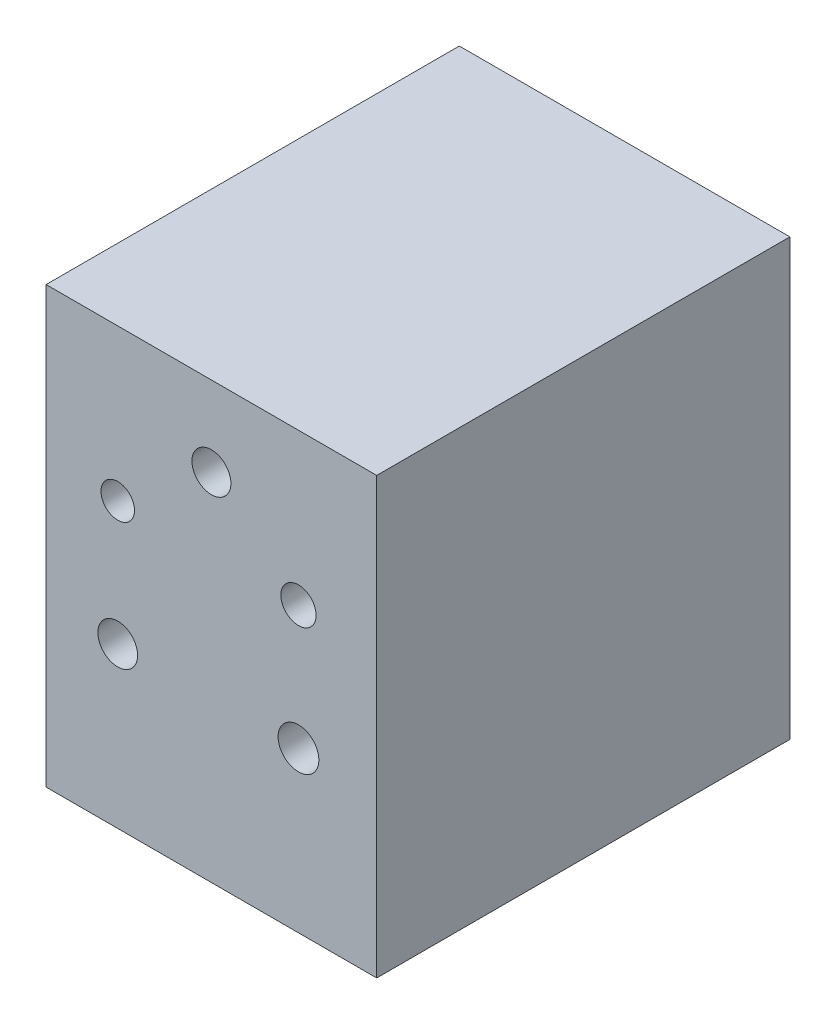
ISO-10303-21;
HEADER;
FILE_DESCRIPTION(('STEP AP214'),'2;1');
FILE_NAME('part.step','',(''),(''),'','','');
FILE_SCHEMA(('AUTOMOTIVE_DESIGN { 1 0 10303 214 1 1 1 1 }'));
ENDSEC;
DATA;
#1=APPLICATION_CONTEXT('core data for automotive mechanical design processes');
#2=APPLICATION_PROTOCOL_DEFINITION('international standard','automotive_design',2000,#1);
#3=PRODUCT_CONTEXT('',#1,'mechanical');
#4=PRODUCT('Part','Part','',(#3));
#5=PRODUCT_RELATED_PRODUCT_CATEGORY('part','',(#4));
#6=PRODUCT_DEFINITION_FORMATION('','',#4);
#7=PRODUCT_DEFINITION_CONTEXT('part definition',#1,'design');
#8=PRODUCT_DEFINITION('design','',#6,#7);
#9=PRODUCT_DEFINITION_SHAPE('','',#8);
#10=(LENGTH_UNIT() NAMED_UNIT(*) SI_UNIT(.MILLI.,.METRE.));
#11=(NAMED_UNIT(*) PLANE_ANGLE_UNIT() SI_UNIT($,.RADIAN.));
#12=(NAMED_UNIT(*) SI_UNIT($,.STERADIAN.) SOLID_ANGLE_UNIT());
#13=UNCERTAINTY_MEASURE_WITH_UNIT(LENGTH_MEASURE(1.E-05),#10,'distance_accuracy_value','');
#14=(GEOMETRIC_REPRESENTATION_CONTEXT(3) GLOBAL_UNCERTAINTY_ASSIGNED_CONTEXT((#13)) GLOBAL_UNIT_ASSIGNED_CONTEXT((#10,
#11,#12)) REPRESENTATION_CONTEXT('',''));
#15=CARTESIAN_POINT('',(0.,0.,0.));
#16=DIRECTION('',(0.,0.,1.));
#17=DIRECTION('',(1.,0.,0.));
#18=AXIS2_PLACEMENT_3D('',#15,#16,#17);
#19=CARTESIAN_POINT('',(0.,0.,115.));
#20=DIRECTION('',(0.,0.,-1.));
#21=DIRECTION('',(-1.,0.,0.));
#22=AXIS2_PLACEMENT_3D('',#19,#20,#21);
#23=PLANE('',#22);
#24=DIRECTION('',(0.,1.,0.));
#25=VECTOR('',#24,1.);
#26=CARTESIAN_POINT('',(120.000640556542,-24.9202664576803,115.));
#27=LINE('',#26,#25);
#28=CARTESIAN_POINT('',(120.000640556542,-24.9202664576803,115.));
#29=VERTEX_POINT('',#28);
#30=CARTESIAN_POINT('',(120.000640556542,96.2305673981191,115.));
#31=VERTEX_POINT('',#30);
#32=EDGE_CURVE('E91',#29,#31,#27,.T.);
#33=ORIENTED_EDGE('',*,*,#32,.T.);
#34=DIRECTION('',(-1.,0.,0.));
#35=VECTOR('',#34,1.);
#36=CARTESIAN_POINT('',(27.987403330605,96.2305673981191,115.));
#37=LINE('',#36,#35);
#38=CARTESIAN_POINT('',(27.987403330605,96.2305673981191,115.));
#39=VERTEX_POINT('',#38);
#40=EDGE_CURVE('E86',#31,#39,#37,.T.);
#41=ORIENTED_EDGE('',*,*,#40,.T.);
#42=DIRECTION('',(0.,-1.,0.));
#43=VECTOR('',#42,1.);
#44=CARTESIAN_POINT('',(27.987403330605,-24.9202664576803,115.));
#45=LINE('',#44,#43);
#46=CARTESIAN_POINT('',(27.987403330605,-24.9202664576803,115.));
#47=VERTEX_POINT('',#46);
#48=EDGE_CURVE('E89',#39,#47,#45,.T.);
#49=ORIENTED_EDGE('',*,*,#48,.T.);
#50=DIRECTION('',(1.,0.,0.));
#51=VECTOR('',#50,1.);
#52=CARTESIAN_POINT('',(27.987403330605,-24.9202664576803,115.));
#53=LINE('',#52,#51);
#54=EDGE_CURVE('E56',#47,#29,#53,.T.);
#55=ORIENTED_EDGE('',*,*,#54,.T.);
#56=EDGE_LOOP('',(#33,#41,#49,#55));
#57=FACE_BOUND('',#56,.T.);
#58=CARTESIAN_POINT('',(73.9940219435737,73.9940219435737,115.));
#59=DIRECTION('',(0.,0.,1.));
#60=DIRECTION('',(1.,0.,0.));
#61=AXIS2_PLACEMENT_3D('',#58,#59,#60);
#62=CIRCLE('',#61,5.42193520036966);
#63=CARTESIAN_POINT('',(79.4159571439433,73.9940219435737,115.));
#64=VERTEX_POINT('',#63);
#65=EDGE_CURVE('E106',#64,#64,#62,.T.);
#66=ORIENTED_EDGE('',*,*,#65,.F.);
#67=EDGE_LOOP('',(#66));
#68=FACE_BOUND('',#67,.T.);
#69=CARTESIAN_POINT('',(47.9235893416928,54.0578087774295,115.));
#70=DIRECTION('',(0.,0.,1.));
#71=DIRECTION('',(1.,0.,0.));
#72=AXIS2_PLACEMENT_3D('',#69,#70,#71);
#73=CIRCLE('',#72,4.66412501704079);
#74=CARTESIAN_POINT('',(52.5877143587336,54.0578087774295,115.));
#75=VERTEX_POINT('',#74);
#76=EDGE_CURVE('E121',#75,#75,#73,.T.);
#77=ORIENTED_EDGE('',*,*,#76,.F.);
#78=EDGE_LOOP('',(#77));
#79=FACE_BOUND('',#78,.T.);
#80=CARTESIAN_POINT('',(98.224203016405,54.0578087774295,115.));
#81=DIRECTION('',(0.,0.,1.));
#82=DIRECTION('',(1.,0.,0.));
#83=AXIS2_PLACEMENT_3D('',#80,#81,#82);
#84=CIRCLE('',#83,4.90736124691786);
#85=CARTESIAN_POINT('',(103.131564263323,54.0578087774295,115.));
#86=VERTEX_POINT('',#85);
#87=EDGE_CURVE('E127',#86,#86,#84,.T.);
#88=ORIENTED_EDGE('',*,*,#87,.F.);
#89=EDGE_LOOP('',(#88));
#90=FACE_BOUND('',#89,.T.);
#91=CARTESIAN_POINT('',(98.224203016405,19.5528244514107,115.));
#92=DIRECTION('',(0.,0.,1.));
#93=DIRECTION('',(1.,0.,0.));
#94=AXIS2_PLACEMENT_3D('',#91,#92,#93);
#95=CIRCLE('',#94,5.67413867638493);
#96=CARTESIAN_POINT('',(103.89834169279,19.5528244514107,115.));
#97=VERTEX_POINT('',#96);
#98=EDGE_CURVE('E133',#97,#97,#95,.T.);
#99=ORIENTED_EDGE('',*,*,#98,.F.);
#100=EDGE_LOOP('',(#99));
#101=FACE_BOUND('',#100,.T.);
#102=CARTESIAN_POINT('',(47.9235893416928,19.5528244514107,115.));
#103=DIRECTION('',(0.,0.,1.));
#104=DIRECTION('',(1.,0.,0.));
#105=AXIS2_PLACEMENT_3D('',#102,#103,#104);
#106=CIRCLE('',#105,5.5293106776241);
#107=CARTESIAN_POINT('',(53.4529000193169,19.5528244514107,115.));
#108=VERTEX_POINT('',#107);
#109=EDGE_CURVE('E139',#108,#108,#106,.T.);
#110=ORIENTED_EDGE('',*,*,#109,.F.);
#111=EDGE_LOOP('',(#110));
#112=FACE_BOUND('',#111,.T.);
#113=ADVANCED_FACE('F39',(#57,#68,#79,#90,#101,#112),#23,.F.);
#114=CARTESIAN_POINT('',(0.,0.,0.));
#115=DIRECTION('',(0.,0.,-1.));
#116=DIRECTION('',(-1.,0.,0.));
#117=AXIS2_PLACEMENT_3D('',#114,#115,#116);
#118=PLANE('',#117);
#119=CARTESIAN_POINT('',(98.224203016405,19.5528244514107,0.));
#120=DIRECTION('',(0.,0.,1.));
#121=DIRECTION('',(1.,0.,0.));
#122=AXIS2_PLACEMENT_3D('',#119,#120,#121);
#123=CIRCLE('',#122,5.67413867638493);
#124=CARTESIAN_POINT('',(103.89834169279,19.5528244514107,0.));
#125=VERTEX_POINT('',#124);
#126=EDGE_CURVE('E136',#125,#125,#123,.T.);
#127=ORIENTED_EDGE('',*,*,#126,.T.);
#128=EDGE_LOOP('',(#127));
#129=FACE_BOUND('',#128,.T.);
#130=CARTESIAN_POINT('',(47.9235893416928,54.0578087774295,0.));
#131=DIRECTION('',(0.,0.,1.));
#132=DIRECTION('',(1.,0.,0.));
#133=AXIS2_PLACEMENT_3D('',#130,#131,#132);
#134=CIRCLE('',#133,4.66412501704079);
#135=CARTESIAN_POINT('',(52.5877143587336,54.0578087774295,0.));
#136=VERTEX_POINT('',#135);
#137=EDGE_CURVE('E124',#136,#136,#134,.T.);
#138=ORIENTED_EDGE('',*,*,#137,.T.);
#139=EDGE_LOOP('',(#138));
#140=FACE_BOUND('',#139,.T.);
#141=DIRECTION('',(0.,1.,0.));
#142=VECTOR('',#141,1.);
#143=CARTESIAN_POINT('',(120.000640556542,-24.9202664576803,0.));
#144=LINE('',#143,#142);
#145=CARTESIAN_POINT('',(120.000640556542,-24.9202664576803,0.));
#146=VERTEX_POINT('',#145);
#147=CARTESIAN_POINT('',(120.000640556542,96.2305673981191,0.));
#148=VERTEX_POINT('',#147);
#149=EDGE_CURVE('E103',#146,#148,#144,.T.);
#150=ORIENTED_EDGE('',*,*,#149,.F.);
#151=DIRECTION('',(1.,0.,0.));
#152=VECTOR('',#151,1.);
#153=CARTESIAN_POINT('',(27.987403330605,-24.9202664576803,0.));
#154=LINE('',#153,#152);
#155=CARTESIAN_POINT('',(27.987403330605,-24.9202664576803,0.));
#156=VERTEX_POINT('',#155);
#157=EDGE_CURVE('E79',#156,#146,#154,.T.);
#158=ORIENTED_EDGE('',*,*,#157,.F.);
#159=DIRECTION('',(0.,-1.,0.));
#160=VECTOR('',#159,1.);
#161=CARTESIAN_POINT('',(27.987403330605,-24.9202664576803,0.));
#162=LINE('',#161,#160);
#163=CARTESIAN_POINT('',(27.987403330605,96.2305673981191,0.));
#164=VERTEX_POINT('',#163);
#165=EDGE_CURVE('E73',#164,#156,#162,.T.);
#166=ORIENTED_EDGE('',*,*,#165,.F.);
#167=DIRECTION('',(-1.,0.,0.));
#168=VECTOR('',#167,1.);
#169=CARTESIAN_POINT('',(27.987403330605,96.2305673981191,0.));
#170=LINE('',#169,#168);
#171=EDGE_CURVE('E95',#148,#164,#170,.T.);
#172=ORIENTED_EDGE('',*,*,#171,.F.);
#173=EDGE_LOOP('',(#150,#158,#166,#172));
#174=FACE_BOUND('',#173,.T.);
#175=CARTESIAN_POINT('',(73.9940219435737,73.9940219435737,0.));
#176=DIRECTION('',(0.,0.,1.));
#177=DIRECTION('',(1.,0.,0.));
#178=AXIS2_PLACEMENT_3D('',#175,#176,#177);
#179=CIRCLE('',#178,5.42193520036966);
#180=CARTESIAN_POINT('',(79.4159571439433,73.9940219435737,0.));
#181=VERTEX_POINT('',#180);
#182=EDGE_CURVE('E118',#181,#181,#179,.T.);
#183=ORIENTED_EDGE('',*,*,#182,.T.);
#184=EDGE_LOOP('',(#183));
#185=FACE_BOUND('',#184,.T.);
#186=CARTESIAN_POINT('',(98.224203016405,54.0578087774295,0.));
#187=DIRECTION('',(0.,0.,1.));
#188=DIRECTION('',(1.,0.,0.));
#189=AXIS2_PLACEMENT_3D('',#186,#187,#188);
#190=CIRCLE('',#189,4.90736124691786);
#191=CARTESIAN_POINT('',(103.131564263323,54.0578087774295,0.));
#192=VERTEX_POINT('',#191);
#193=EDGE_CURVE('E130',#192,#192,#190,.T.);
#194=ORIENTED_EDGE('',*,*,#193,.T.);
#195=EDGE_LOOP('',(#194));
#196=FACE_BOUND('',#195,.T.);
#197=CARTESIAN_POINT('',(47.9235893416928,19.5528244514107,0.));
#198=DIRECTION('',(0.,0.,1.));
#199=DIRECTION('',(1.,0.,0.));
#200=AXIS2_PLACEMENT_3D('',#197,#198,#199);
#201=CIRCLE('',#200,5.5293106776241);
#202=CARTESIAN_POINT('',(53.4529000193169,19.5528244514107,0.));
#203=VERTEX_POINT('',#202);
#204=EDGE_CURVE('E142',#203,#203,#201,.T.);
#205=ORIENTED_EDGE('',*,*,#204,.T.);
#206=EDGE_LOOP('',(#205));
#207=FACE_BOUND('',#206,.T.);
#208=ADVANCED_FACE('F114',(#129,#140,#174,#185,#196,#207),#118,.T.);
#209=CARTESIAN_POINT('',(120.000640556542,-24.9202664576803,115.));
#210=DIRECTION('',(-1.,0.,0.));
#211=DIRECTION('',(0.,0.,1.));
#212=AXIS2_PLACEMENT_3D('',#209,#210,#211);
#213=PLANE('',#212);
#214=ORIENTED_EDGE('',*,*,#149,.T.);
#215=DIRECTION('',(0.,0.,-1.));
#216=VECTOR('',#215,1.);
#217=CARTESIAN_POINT('',(120.000640556542,96.2305673981191,115.));
#218=LINE('',#217,#216);
#219=EDGE_CURVE('E11',#31,#148,#218,.T.);
#220=ORIENTED_EDGE('',*,*,#219,.F.);
#221=ORIENTED_EDGE('',*,*,#32,.F.);
#222=DIRECTION('',(0.,0.,-1.));
#223=VECTOR('',#222,1.);
#224=CARTESIAN_POINT('',(120.000640556542,-24.9202664576803,115.));
#225=LINE('',#224,#223);
#226=EDGE_CURVE('E99',#29,#146,#225,.T.);
#227=ORIENTED_EDGE('',*,*,#226,.T.);
#228=EDGE_LOOP('',(#214,#220,#221,#227));
#229=FACE_BOUND('',#228,.T.);
#230=ADVANCED_FACE('F41',(#229),#213,.F.);
#231=CARTESIAN_POINT('',(27.987403330605,96.2305673981191,115.));
#232=DIRECTION('',(0.,-1.,0.));
#233=DIRECTION('',(0.,0.,-1.));
#234=AXIS2_PLACEMENT_3D('',#231,#232,#233);
#235=PLANE('',#234);
#236=ORIENTED_EDGE('',*,*,#171,.T.);
#237=DIRECTION('',(0.,0.,-1.));
#238=VECTOR('',#237,1.);
#239=CARTESIAN_POINT('',(27.987403330605,96.2305673981191,115.));
#240=LINE('',#239,#238);
#241=EDGE_CURVE('E48',#39,#164,#240,.T.);
#242=ORIENTED_EDGE('',*,*,#241,.F.);
#243=ORIENTED_EDGE('',*,*,#40,.F.);
#244=ORIENTED_EDGE('',*,*,#219,.T.);
#245=EDGE_LOOP('',(#236,#242,#243,#244));
#246=FACE_BOUND('',#245,.T.);
#247=ADVANCED_FACE('F94',(#246),#235,.F.);
#248=CARTESIAN_POINT('',(27.987403330605,-24.9202664576803,115.));
#249=DIRECTION('',(1.,0.,0.));
#250=DIRECTION('',(0.,0.,-1.));
#251=AXIS2_PLACEMENT_3D('',#248,#249,#250);
#252=PLANE('',#251);
#253=ORIENTED_EDGE('',*,*,#165,.T.);
#254=DIRECTION('',(0.,0.,-1.));
#255=VECTOR('',#254,1.);
#256=CARTESIAN_POINT('',(27.987403330605,-24.9202664576803,115.));
#257=LINE('',#256,#255);
#258=EDGE_CURVE('E96',#47,#156,#257,.T.);
#259=ORIENTED_EDGE('',*,*,#258,.F.);
#260=ORIENTED_EDGE('',*,*,#48,.F.);
#261=ORIENTED_EDGE('',*,*,#241,.T.);
#262=EDGE_LOOP('',(#253,#259,#260,#261));
#263=FACE_BOUND('',#262,.T.);
#264=ADVANCED_FACE('F97',(#263),#252,.F.);
#265=CARTESIAN_POINT('',(27.987403330605,-24.9202664576803,115.));
#266=DIRECTION('',(0.,1.,0.));
#267=DIRECTION('',(0.,0.,1.));
#268=AXIS2_PLACEMENT_3D('',#265,#266,#267);
#269=PLANE('',#268);
#270=ORIENTED_EDGE('',*,*,#157,.T.);
#271=ORIENTED_EDGE('',*,*,#226,.F.);
#272=ORIENTED_EDGE('',*,*,#54,.F.);
#273=ORIENTED_EDGE('',*,*,#258,.T.);
#274=EDGE_LOOP('',(#270,#271,#272,#273));
#275=FACE_BOUND('',#274,.T.);
#276=ADVANCED_FACE('F111',(#275),#269,.F.);
#277=CARTESIAN_POINT('',(73.9940219435737,73.9940219435737,115.));
#278=DIRECTION('',(0.,0.,-1.));
#279=DIRECTION('',(-1.,0.,0.));
#280=AXIS2_PLACEMENT_3D('',#277,#278,#279);
#281=CYLINDRICAL_SURFACE('',#280,5.42193520036966);
#282=ORIENTED_EDGE('',*,*,#65,.T.);
#283=EDGE_LOOP('',(#282));
#284=FACE_BOUND('',#283,.T.);
#285=ORIENTED_EDGE('',*,*,#182,.F.);
#286=EDGE_LOOP('',(#285));
#287=FACE_BOUND('',#286,.T.);
#288=ADVANCED_FACE('F159',(#284,#287),#281,.F.);
#289=CARTESIAN_POINT('',(47.9235893416928,54.0578087774295,115.));
#290=DIRECTION('',(0.,0.,-1.));
#291=DIRECTION('',(-1.,0.,0.));
#292=AXIS2_PLACEMENT_3D('',#289,#290,#291);
#293=CYLINDRICAL_SURFACE('',#292,4.66412501704079);
#294=ORIENTED_EDGE('',*,*,#76,.T.);
#295=EDGE_LOOP('',(#294));
#296=FACE_BOUND('',#295,.T.);
#297=ORIENTED_EDGE('',*,*,#137,.F.);
#298=EDGE_LOOP('',(#297));
#299=FACE_BOUND('',#298,.T.);
#300=ADVANCED_FACE('F204',(#296,#299),#293,.F.);
#301=CARTESIAN_POINT('',(98.224203016405,54.0578087774295,115.));
#302=DIRECTION('',(0.,0.,-1.));
#303=DIRECTION('',(-1.,0.,0.));
#304=AXIS2_PLACEMENT_3D('',#301,#302,#303);
#305=CYLINDRICAL_SURFACE('',#304,4.90736124691786);
#306=ORIENTED_EDGE('',*,*,#87,.T.);
#307=EDGE_LOOP('',(#306));
#308=FACE_BOUND('',#307,.T.);
#309=ORIENTED_EDGE('',*,*,#193,.F.);
#310=EDGE_LOOP('',(#309));
#311=FACE_BOUND('',#310,.T.);
#312=ADVANCED_FACE('F212',(#308,#311),#305,.F.);
#313=CARTESIAN_POINT('',(98.224203016405,19.5528244514107,115.));
#314=DIRECTION('',(0.,0.,-1.));
#315=DIRECTION('',(-1.,0.,0.));
#316=AXIS2_PLACEMENT_3D('',#313,#314,#315);
#317=CYLINDRICAL_SURFACE('',#316,5.67413867638493);
#318=ORIENTED_EDGE('',*,*,#98,.T.);
#319=EDGE_LOOP('',(#318));
#320=FACE_BOUND('',#319,.T.);
#321=ORIENTED_EDGE('',*,*,#126,.F.);
#322=EDGE_LOOP('',(#321));
#323=FACE_BOUND('',#322,.T.);
#324=ADVANCED_FACE('F220',(#320,#323),#317,.F.);
#325=CARTESIAN_POINT('',(47.9235893416928,19.5528244514107,115.));
#326=DIRECTION('',(0.,0.,-1.));
#327=DIRECTION('',(-1.,0.,0.));
#328=AXIS2_PLACEMENT_3D('',#325,#326,#327);
#329=CYLINDRICAL_SURFACE('',#328,5.5293106776241);
#330=ORIENTED_EDGE('',*,*,#109,.T.);
#331=EDGE_LOOP('',(#330));
#332=FACE_BOUND('',#331,.T.);
#333=ORIENTED_EDGE('',*,*,#204,.F.);
#334=EDGE_LOOP('',(#333));
#335=FACE_BOUND('',#334,.T.);
#336=ADVANCED_FACE('F148',(#332,#335),#329,.F.);
#337=CLOSED_SHELL('',(#113,#208,#230,#247,#264,#276,#288,#300,#312,#324,#336));
#338=MANIFOLD_SOLID_BREP('B2',#337);
#339=ADVANCED_BREP_SHAPE_REPRESENTATION('',(#18,#338),#14);
#340=SHAPE_DEFINITION_REPRESENTATION(#9,#339);
ENDSEC;
END-ISO-10303-21;
